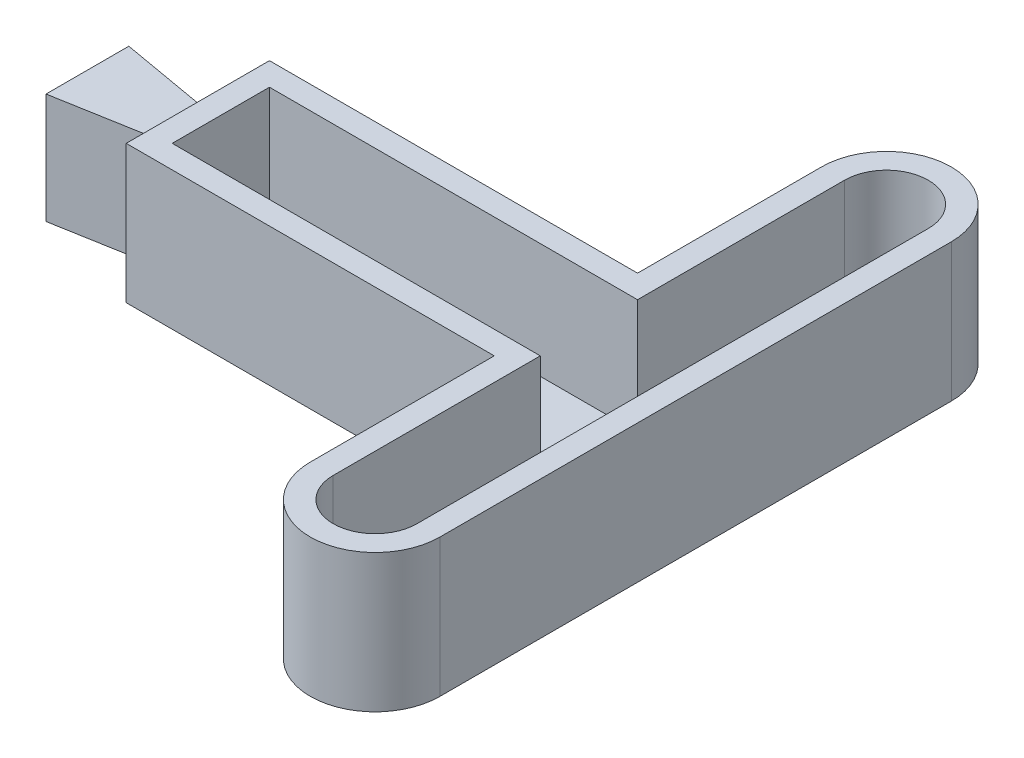
ISO-10303-21;
HEADER;
FILE_DESCRIPTION(('STEP AP214'),'2;1');
FILE_NAME('part.step','',(''),(''),'','','');
FILE_SCHEMA(('AUTOMOTIVE_DESIGN { 1 0 10303 214 1 1 1 1 }'));
ENDSEC;
DATA;
#1=APPLICATION_CONTEXT('core data for automotive mechanical design processes');
#2=APPLICATION_PROTOCOL_DEFINITION('international standard','automotive_design',2000,#1);
#3=PRODUCT_CONTEXT('',#1,'mechanical');
#4=PRODUCT('Part','Part','',(#3));
#5=PRODUCT_RELATED_PRODUCT_CATEGORY('part','',(#4));
#6=PRODUCT_DEFINITION_FORMATION('','',#4);
#7=PRODUCT_DEFINITION_CONTEXT('part definition',#1,'design');
#8=PRODUCT_DEFINITION('design','',#6,#7);
#9=PRODUCT_DEFINITION_SHAPE('','',#8);
#10=(LENGTH_UNIT() NAMED_UNIT(*) SI_UNIT(.MILLI.,.METRE.));
#11=(NAMED_UNIT(*) PLANE_ANGLE_UNIT() SI_UNIT($,.RADIAN.));
#12=(NAMED_UNIT(*) SI_UNIT($,.STERADIAN.) SOLID_ANGLE_UNIT());
#13=UNCERTAINTY_MEASURE_WITH_UNIT(LENGTH_MEASURE(1.E-05),#10,'distance_accuracy_value','');
#14=(GEOMETRIC_REPRESENTATION_CONTEXT(3) GLOBAL_UNCERTAINTY_ASSIGNED_CONTEXT((#13)) GLOBAL_UNIT_ASSIGNED_CONTEXT((#10,
#11,#12)) REPRESENTATION_CONTEXT('',''));
#15=CARTESIAN_POINT('',(0.,0.,0.));
#16=DIRECTION('',(0.,0.,1.));
#17=DIRECTION('',(1.,0.,0.));
#18=AXIS2_PLACEMENT_3D('',#15,#16,#17);
#19=CARTESIAN_POINT('',(0.,38.1,-11.43));
#20=DIRECTION('',(-0.173648177666928,0.,0.984807753012208));
#21=DIRECTION('',(0.984807753012209,0.,0.173648177666928));
#22=AXIS2_PLACEMENT_3D('',#19,#20,#21);
#23=PLANE('',#22);
#24=DIRECTION('',(0.,-1.,0.));
#25=VECTOR('',#24,1.);
#26=CARTESIAN_POINT('',(0.,38.1,-11.43));
#27=LINE('',#26,#25);
#28=CARTESIAN_POINT('',(0.,30.48,-11.43));
#29=VERTEX_POINT('',#28);
#30=CARTESIAN_POINT('',(0.,0.,-11.43));
#31=VERTEX_POINT('',#30);
#32=EDGE_CURVE('E11',#29,#31,#27,.T.);
#33=ORIENTED_EDGE('',*,*,#32,.F.);
#34=DIRECTION('',(0.984807753012209,0.,0.173648177666928));
#35=VECTOR('',#34,1.);
#36=CARTESIAN_POINT('',(0.,30.48,-11.43));
#37=LINE('',#36,#35);
#38=CARTESIAN_POINT('',(30.48,30.48,-6.05555362800607));
#39=VERTEX_POINT('',#38);
#40=EDGE_CURVE('E166',#29,#39,#37,.T.);
#41=ORIENTED_EDGE('',*,*,#40,.T.);
#42=DIRECTION('',(0.,-1.,0.));
#43=VECTOR('',#42,1.);
#44=CARTESIAN_POINT('',(30.48,38.1,-6.05555362800607));
#45=LINE('',#44,#43);
#46=CARTESIAN_POINT('',(30.48,0.,-6.05555362800607));
#47=VERTEX_POINT('',#46);
#48=EDGE_CURVE('E113',#39,#47,#45,.T.);
#49=ORIENTED_EDGE('',*,*,#48,.T.);
#50=DIRECTION('',(-0.984807753012208,0.,-0.173648177666928));
#51=VECTOR('',#50,1.);
#52=CARTESIAN_POINT('',(0.,0.,-11.43));
#53=LINE('',#52,#51);
#54=EDGE_CURVE('E163',#47,#31,#53,.T.);
#55=ORIENTED_EDGE('',*,*,#54,.T.);
#56=EDGE_LOOP('',(#33,#41,#49,#55));
#57=FACE_BOUND('',#56,.T.);
#58=ADVANCED_FACE('F44',(#57),#23,.F.);
#59=CARTESIAN_POINT('',(0.,38.1,-11.43));
#60=DIRECTION('',(1.,0.,0.));
#61=DIRECTION('',(0.,0.,-1.));
#62=AXIS2_PLACEMENT_3D('',#59,#60,#61);
#63=PLANE('',#62);
#64=DIRECTION('',(0.,-1.,0.));
#65=VECTOR('',#64,1.);
#66=CARTESIAN_POINT('',(0.,38.1,11.43));
#67=LINE('',#66,#65);
#68=CARTESIAN_POINT('',(0.,30.48,11.43));
#69=VERTEX_POINT('',#68);
#70=CARTESIAN_POINT('',(0.,0.,11.43));
#71=VERTEX_POINT('',#70);
#72=EDGE_CURVE('E51',#69,#71,#67,.T.);
#73=ORIENTED_EDGE('',*,*,#72,.F.);
#74=DIRECTION('',(0.,0.,1.));
#75=VECTOR('',#74,1.);
#76=CARTESIAN_POINT('',(0.,30.48,11.43));
#77=LINE('',#76,#75);
#78=EDGE_CURVE('E419',#29,#69,#77,.T.);
#79=ORIENTED_EDGE('',*,*,#78,.F.);
#80=ORIENTED_EDGE('',*,*,#32,.T.);
#81=DIRECTION('',(0.,0.,1.));
#82=VECTOR('',#81,1.);
#83=CARTESIAN_POINT('',(0.,0.,-11.43));
#84=LINE('',#83,#82);
#85=EDGE_CURVE('E165',#31,#71,#84,.T.);
#86=ORIENTED_EDGE('',*,*,#85,.T.);
#87=EDGE_LOOP('',(#73,#79,#80,#86));
#88=FACE_BOUND('',#87,.T.);
#89=ADVANCED_FACE('F219',(#88),#63,.F.);
#90=CARTESIAN_POINT('',(0.,38.1,11.43));
#91=DIRECTION('',(-0.173648177666928,0.,-0.984807753012208));
#92=DIRECTION('',(-0.984807753012209,0.,0.173648177666928));
#93=AXIS2_PLACEMENT_3D('',#90,#91,#92);
#94=PLANE('',#93);
#95=DIRECTION('',(0.,-1.,0.));
#96=VECTOR('',#95,1.);
#97=CARTESIAN_POINT('',(30.48,38.1,6.05555362800607));
#98=LINE('',#97,#96);
#99=CARTESIAN_POINT('',(30.48,30.48,6.05555362800607));
#100=VERTEX_POINT('',#99);
#101=CARTESIAN_POINT('',(30.48,0.,6.05555362800607));
#102=VERTEX_POINT('',#101);
#103=EDGE_CURVE('E206',#100,#102,#98,.T.);
#104=ORIENTED_EDGE('',*,*,#103,.F.);
#105=DIRECTION('',(0.984807753012209,0.,-0.173648177666928));
#106=VECTOR('',#105,1.);
#107=CARTESIAN_POINT('',(30.48,30.48,6.05555362800607));
#108=LINE('',#107,#106);
#109=EDGE_CURVE('E215',#69,#100,#108,.T.);
#110=ORIENTED_EDGE('',*,*,#109,.F.);
#111=ORIENTED_EDGE('',*,*,#72,.T.);
#112=DIRECTION('',(0.984807753012209,0.,-0.173648177666928));
#113=VECTOR('',#112,1.);
#114=CARTESIAN_POINT('',(0.,0.,11.43));
#115=LINE('',#114,#113);
#116=EDGE_CURVE('E169',#71,#102,#115,.T.);
#117=ORIENTED_EDGE('',*,*,#116,.T.);
#118=EDGE_LOOP('',(#104,#110,#111,#117));
#119=FACE_BOUND('',#118,.T.);
#120=ADVANCED_FACE('F211',(#119),#94,.F.);
#121=CARTESIAN_POINT('',(30.48,38.1,19.7715536280061));
#122=DIRECTION('',(0.,0.,-1.));
#123=DIRECTION('',(-1.,0.,0.));
#124=AXIS2_PLACEMENT_3D('',#121,#122,#123);
#125=PLANE('',#124);
#126=DIRECTION('',(1.,0.,0.));
#127=VECTOR('',#126,1.);
#128=CARTESIAN_POINT('',(30.48,0.,19.7715536280061));
#129=LINE('',#128,#127);
#130=CARTESIAN_POINT('',(30.48,0.,19.7715536280061));
#131=VERTEX_POINT('',#130);
#132=CARTESIAN_POINT('',(132.08,0.,19.7715536280061));
#133=VERTEX_POINT('',#132);
#134=EDGE_CURVE('E174',#131,#133,#129,.T.);
#135=ORIENTED_EDGE('',*,*,#134,.T.);
#136=DIRECTION('',(0.,-1.,0.));
#137=VECTOR('',#136,1.);
#138=CARTESIAN_POINT('',(132.08,38.1,19.7715536280061));
#139=LINE('',#138,#137);
#140=CARTESIAN_POINT('',(132.08,38.1,19.7715536280061));
#141=VERTEX_POINT('',#140);
#142=EDGE_CURVE('E200',#141,#133,#139,.T.);
#143=ORIENTED_EDGE('',*,*,#142,.F.);
#144=DIRECTION('',(1.,0.,0.));
#145=VECTOR('',#144,1.);
#146=CARTESIAN_POINT('',(30.48,38.1,19.7715536280061));
#147=LINE('',#146,#145);
#148=CARTESIAN_POINT('',(30.48,38.1,19.7715536280061));
#149=VERTEX_POINT('',#148);
#150=EDGE_CURVE('E232',#149,#141,#147,.T.);
#151=ORIENTED_EDGE('',*,*,#150,.F.);
#152=DIRECTION('',(0.,-1.,0.));
#153=VECTOR('',#152,1.);
#154=CARTESIAN_POINT('',(30.48,38.1,19.7715536280061));
#155=LINE('',#154,#153);
#156=EDGE_CURVE('E203',#149,#131,#155,.T.);
#157=ORIENTED_EDGE('',*,*,#156,.T.);
#158=EDGE_LOOP('',(#135,#143,#151,#157));
#159=FACE_BOUND('',#158,.T.);
#160=ADVANCED_FACE('F230',(#159),#125,.F.);
#161=CARTESIAN_POINT('',(132.08,38.1,19.7715536280061));
#162=DIRECTION('',(1.,0.,0.));
#163=DIRECTION('',(0.,0.,-1.));
#164=AXIS2_PLACEMENT_3D('',#161,#162,#163);
#165=PLANE('',#164);
#166=DIRECTION('',(0.,0.,1.));
#167=VECTOR('',#166,1.);
#168=CARTESIAN_POINT('',(132.08,0.,19.7715536280061));
#169=LINE('',#168,#167);
#170=CARTESIAN_POINT('',(132.08,0.,70.5715536280061));
#171=VERTEX_POINT('',#170);
#172=EDGE_CURVE('E176',#133,#171,#169,.T.);
#173=ORIENTED_EDGE('',*,*,#172,.T.);
#174=DIRECTION('',(0.,-1.,0.));
#175=VECTOR('',#174,1.);
#176=CARTESIAN_POINT('',(132.08,38.1,70.5715536280061));
#177=LINE('',#176,#175);
#178=CARTESIAN_POINT('',(132.08,38.1,70.5715536280061));
#179=VERTEX_POINT('',#178);
#180=EDGE_CURVE('E197',#179,#171,#177,.T.);
#181=ORIENTED_EDGE('',*,*,#180,.F.);
#182=DIRECTION('',(0.,0.,1.));
#183=VECTOR('',#182,1.);
#184=CARTESIAN_POINT('',(132.08,38.1,19.7715536280061));
#185=LINE('',#184,#183);
#186=EDGE_CURVE('E234',#141,#179,#185,.T.);
#187=ORIENTED_EDGE('',*,*,#186,.F.);
#188=ORIENTED_EDGE('',*,*,#142,.T.);
#189=EDGE_LOOP('',(#173,#181,#187,#188));
#190=FACE_BOUND('',#189,.T.);
#191=ADVANCED_FACE('F447',(#190),#165,.F.);
#192=CARTESIAN_POINT('',(149.987,38.1,70.5715536280061));
#193=DIRECTION('',(0.,-1.,0.));
#194=DIRECTION('',(0.,0.,-1.));
#195=AXIS2_PLACEMENT_3D('',#192,#193,#194);
#196=CYLINDRICAL_SURFACE('',#195,17.907);
#197=CARTESIAN_POINT('',(149.987,0.,70.5715536280061));
#198=DIRECTION('',(0.,1.,0.));
#199=DIRECTION('',(0.,0.,-1.));
#200=AXIS2_PLACEMENT_3D('',#197,#198,#199);
#201=CIRCLE('',#200,17.907);
#202=CARTESIAN_POINT('',(167.894,0.,70.5715536280061));
#203=VERTEX_POINT('',#202);
#204=EDGE_CURVE('E178',#171,#203,#201,.T.);
#205=ORIENTED_EDGE('',*,*,#204,.T.);
#206=DIRECTION('',(0.,-1.,0.));
#207=VECTOR('',#206,1.);
#208=CARTESIAN_POINT('',(167.894,38.1,70.5715536280061));
#209=LINE('',#208,#207);
#210=CARTESIAN_POINT('',(167.894,38.1,70.5715536280061));
#211=VERTEX_POINT('',#210);
#212=EDGE_CURVE('E194',#211,#203,#209,.T.);
#213=ORIENTED_EDGE('',*,*,#212,.F.);
#214=CARTESIAN_POINT('',(149.987,38.1,70.5715536280061));
#215=DIRECTION('',(0.,1.,0.));
#216=DIRECTION('',(0.,0.,-1.));
#217=AXIS2_PLACEMENT_3D('',#214,#215,#216);
#218=CIRCLE('',#217,17.907);
#219=EDGE_CURVE('E236',#179,#211,#218,.T.);
#220=ORIENTED_EDGE('',*,*,#219,.F.);
#221=ORIENTED_EDGE('',*,*,#180,.T.);
#222=EDGE_LOOP('',(#205,#213,#220,#221));
#223=FACE_BOUND('',#222,.T.);
#224=ADVANCED_FACE('F245',(#223),#196,.T.);
#225=CARTESIAN_POINT('',(167.894,38.1,-70.5715536280061));
#226=DIRECTION('',(-1.,0.,0.));
#227=DIRECTION('',(0.,0.,1.));
#228=AXIS2_PLACEMENT_3D('',#225,#226,#227);
#229=PLANE('',#228);
#230=DIRECTION('',(0.,0.,-1.));
#231=VECTOR('',#230,1.);
#232=CARTESIAN_POINT('',(167.894,0.,-70.5715536280061));
#233=LINE('',#232,#231);
#234=CARTESIAN_POINT('',(167.894,0.,-70.5715536280061));
#235=VERTEX_POINT('',#234);
#236=EDGE_CURVE('E180',#203,#235,#233,.T.);
#237=ORIENTED_EDGE('',*,*,#236,.T.);
#238=DIRECTION('',(0.,-1.,0.));
#239=VECTOR('',#238,1.);
#240=CARTESIAN_POINT('',(167.894,38.1,-70.5715536280061));
#241=LINE('',#240,#239);
#242=CARTESIAN_POINT('',(167.894,38.1,-70.5715536280061));
#243=VERTEX_POINT('',#242);
#244=EDGE_CURVE('E152',#243,#235,#241,.T.);
#245=ORIENTED_EDGE('',*,*,#244,.F.);
#246=DIRECTION('',(0.,0.,-1.));
#247=VECTOR('',#246,1.);
#248=CARTESIAN_POINT('',(167.894,38.1,-70.5715536280061));
#249=LINE('',#248,#247);
#250=EDGE_CURVE('E140',#211,#243,#249,.T.);
#251=ORIENTED_EDGE('',*,*,#250,.F.);
#252=ORIENTED_EDGE('',*,*,#212,.T.);
#253=EDGE_LOOP('',(#237,#245,#251,#252));
#254=FACE_BOUND('',#253,.T.);
#255=ADVANCED_FACE('F249',(#254),#229,.F.);
#256=CARTESIAN_POINT('',(149.987,38.1,-70.5715536280061));
#257=DIRECTION('',(0.,-1.,0.));
#258=DIRECTION('',(0.,0.,-1.));
#259=AXIS2_PLACEMENT_3D('',#256,#257,#258);
#260=CYLINDRICAL_SURFACE('',#259,17.907);
#261=CARTESIAN_POINT('',(149.987,0.,-70.5715536280061));
#262=DIRECTION('',(0.,1.,0.));
#263=DIRECTION('',(0.,0.,1.));
#264=AXIS2_PLACEMENT_3D('',#261,#262,#263);
#265=CIRCLE('',#264,17.907);
#266=CARTESIAN_POINT('',(132.08,0.,-70.5715536280061));
#267=VERTEX_POINT('',#266);
#268=EDGE_CURVE('E149',#235,#267,#265,.T.);
#269=ORIENTED_EDGE('',*,*,#268,.T.);
#270=DIRECTION('',(0.,-1.,0.));
#271=VECTOR('',#270,1.);
#272=CARTESIAN_POINT('',(132.08,38.1,-70.5715536280061));
#273=LINE('',#272,#271);
#274=CARTESIAN_POINT('',(132.08,38.1,-70.5715536280061));
#275=VERTEX_POINT('',#274);
#276=EDGE_CURVE('E146',#275,#267,#273,.T.);
#277=ORIENTED_EDGE('',*,*,#276,.F.);
#278=CARTESIAN_POINT('',(149.987,38.1,-70.5715536280061));
#279=DIRECTION('',(0.,1.,0.));
#280=DIRECTION('',(0.,0.,1.));
#281=AXIS2_PLACEMENT_3D('',#278,#279,#280);
#282=CIRCLE('',#281,17.907);
#283=EDGE_CURVE('E133',#243,#275,#282,.T.);
#284=ORIENTED_EDGE('',*,*,#283,.F.);
#285=ORIENTED_EDGE('',*,*,#244,.T.);
#286=EDGE_LOOP('',(#269,#277,#284,#285));
#287=FACE_BOUND('',#286,.T.);
#288=ADVANCED_FACE('F147',(#287),#260,.T.);
#289=CARTESIAN_POINT('',(132.08,38.1,-19.7715536280061));
#290=DIRECTION('',(1.,0.,0.));
#291=DIRECTION('',(0.,0.,-1.));
#292=AXIS2_PLACEMENT_3D('',#289,#290,#291);
#293=PLANE('',#292);
#294=DIRECTION('',(0.,0.,1.));
#295=VECTOR('',#294,1.);
#296=CARTESIAN_POINT('',(132.08,0.,-19.7715536280061));
#297=LINE('',#296,#295);
#298=CARTESIAN_POINT('',(132.08,0.,-19.7715536280061));
#299=VERTEX_POINT('',#298);
#300=EDGE_CURVE('E183',#267,#299,#297,.T.);
#301=ORIENTED_EDGE('',*,*,#300,.T.);
#302=DIRECTION('',(0.,-1.,0.));
#303=VECTOR('',#302,1.);
#304=CARTESIAN_POINT('',(132.08,38.1,-19.7715536280061));
#305=LINE('',#304,#303);
#306=CARTESIAN_POINT('',(132.08,38.1,-19.7715536280061));
#307=VERTEX_POINT('',#306);
#308=EDGE_CURVE('E153',#307,#299,#305,.T.);
#309=ORIENTED_EDGE('',*,*,#308,.F.);
#310=DIRECTION('',(0.,0.,1.));
#311=VECTOR('',#310,1.);
#312=CARTESIAN_POINT('',(132.08,38.1,-19.7715536280061));
#313=LINE('',#312,#311);
#314=EDGE_CURVE('E137',#275,#307,#313,.T.);
#315=ORIENTED_EDGE('',*,*,#314,.F.);
#316=ORIENTED_EDGE('',*,*,#276,.T.);
#317=EDGE_LOOP('',(#301,#309,#315,#316));
#318=FACE_BOUND('',#317,.T.);
#319=ADVANCED_FACE('F155',(#318),#293,.F.);
#320=CARTESIAN_POINT('',(30.48,38.1,-19.7715536280061));
#321=DIRECTION('',(0.,0.,1.));
#322=DIRECTION('',(1.,0.,0.));
#323=AXIS2_PLACEMENT_3D('',#320,#321,#322);
#324=PLANE('',#323);
#325=DIRECTION('',(-1.,0.,0.));
#326=VECTOR('',#325,1.);
#327=CARTESIAN_POINT('',(30.48,0.,-19.7715536280061));
#328=LINE('',#327,#326);
#329=CARTESIAN_POINT('',(30.48,0.,-19.7715536280061));
#330=VERTEX_POINT('',#329);
#331=EDGE_CURVE('E185',#299,#330,#328,.T.);
#332=ORIENTED_EDGE('',*,*,#331,.T.);
#333=DIRECTION('',(0.,-1.,0.));
#334=VECTOR('',#333,1.);
#335=CARTESIAN_POINT('',(30.48,38.1,-19.7715536280061));
#336=LINE('',#335,#334);
#337=CARTESIAN_POINT('',(30.48,38.1,-19.7715536280061));
#338=VERTEX_POINT('',#337);
#339=EDGE_CURVE('E190',#338,#330,#336,.T.);
#340=ORIENTED_EDGE('',*,*,#339,.F.);
#341=DIRECTION('',(-1.,0.,0.));
#342=VECTOR('',#341,1.);
#343=CARTESIAN_POINT('',(30.48,38.1,-19.7715536280061));
#344=LINE('',#343,#342);
#345=EDGE_CURVE('E158',#307,#338,#344,.T.);
#346=ORIENTED_EDGE('',*,*,#345,.F.);
#347=ORIENTED_EDGE('',*,*,#308,.T.);
#348=EDGE_LOOP('',(#332,#340,#346,#347));
#349=FACE_BOUND('',#348,.T.);
#350=ADVANCED_FACE('F253',(#349),#324,.F.);
#351=CARTESIAN_POINT('',(30.48,38.1,-6.05555362800607));
#352=DIRECTION('',(1.,0.,0.));
#353=DIRECTION('',(0.,0.,-1.));
#354=AXIS2_PLACEMENT_3D('',#351,#352,#353);
#355=PLANE('',#354);
#356=DIRECTION('',(0.,0.,1.));
#357=VECTOR('',#356,1.);
#358=CARTESIAN_POINT('',(30.48,0.,-6.05555362800607));
#359=LINE('',#358,#357);
#360=EDGE_CURVE('E187',#330,#47,#359,.T.);
#361=ORIENTED_EDGE('',*,*,#360,.T.);
#362=ORIENTED_EDGE('',*,*,#48,.F.);
#363=DIRECTION('',(0.,0.,-1.));
#364=VECTOR('',#363,1.);
#365=CARTESIAN_POINT('',(30.48,30.48,-6.05555362800607));
#366=LINE('',#365,#364);
#367=EDGE_CURVE('E417',#100,#39,#366,.T.);
#368=ORIENTED_EDGE('',*,*,#367,.F.);
#369=ORIENTED_EDGE('',*,*,#103,.T.);
#370=DIRECTION('',(0.,0.,1.));
#371=VECTOR('',#370,1.);
#372=CARTESIAN_POINT('',(30.48,0.,6.05555362800607));
#373=LINE('',#372,#371);
#374=EDGE_CURVE('E172',#102,#131,#373,.T.);
#375=ORIENTED_EDGE('',*,*,#374,.T.);
#376=ORIENTED_EDGE('',*,*,#156,.F.);
#377=DIRECTION('',(0.,0.,1.));
#378=VECTOR('',#377,1.);
#379=CARTESIAN_POINT('',(30.48,38.1,6.05555362800607));
#380=LINE('',#379,#378);
#381=EDGE_CURVE('E67',#338,#149,#380,.T.);
#382=ORIENTED_EDGE('',*,*,#381,.F.);
#383=ORIENTED_EDGE('',*,*,#339,.T.);
#384=EDGE_LOOP('',(#361,#362,#368,#369,#375,#376,#382,#383));
#385=FACE_BOUND('',#384,.T.);
#386=ADVANCED_FACE('F226',(#385),#355,.F.);
#387=CARTESIAN_POINT('',(149.987,38.1,-70.5715536280061));
#388=DIRECTION('',(0.,1.,0.));
#389=DIRECTION('',(0.,0.,1.));
#390=AXIS2_PLACEMENT_3D('',#387,#388,#389);
#391=PLANE('',#390);
#392=DIRECTION('',(-1.,0.,0.));
#393=VECTOR('',#392,1.);
#394=CARTESIAN_POINT('',(30.48,38.1,-13.4215536280061));
#395=LINE('',#394,#393);
#396=CARTESIAN_POINT('',(138.43,38.1,-13.4215536280061));
#397=VERTEX_POINT('',#396);
#398=CARTESIAN_POINT('',(36.83,38.1,-13.4215536280061));
#399=VERTEX_POINT('',#398);
#400=EDGE_CURVE('E374',#397,#399,#395,.T.);
#401=ORIENTED_EDGE('',*,*,#400,.F.);
#402=DIRECTION('',(0.,0.,1.));
#403=VECTOR('',#402,1.);
#404=CARTESIAN_POINT('',(138.43,38.1,-19.7715536280061));
#405=LINE('',#404,#403);
#406=CARTESIAN_POINT('',(138.43,38.1,-70.5715536280061));
#407=VERTEX_POINT('',#406);
#408=EDGE_CURVE('E412',#407,#397,#405,.T.);
#409=ORIENTED_EDGE('',*,*,#408,.F.);
#410=CARTESIAN_POINT('',(149.987,38.1,-70.5715536280061));
#411=DIRECTION('',(0.,1.,0.));
#412=DIRECTION('',(0.,0.,1.));
#413=AXIS2_PLACEMENT_3D('',#410,#411,#412);
#414=CIRCLE('',#413,11.557);
#415=CARTESIAN_POINT('',(161.544,38.1,-70.5715536280061));
#416=VERTEX_POINT('',#415);
#417=EDGE_CURVE('E410',#416,#407,#414,.T.);
#418=ORIENTED_EDGE('',*,*,#417,.F.);
#419=DIRECTION('',(0.,0.,-1.));
#420=VECTOR('',#419,1.);
#421=CARTESIAN_POINT('',(161.544,38.1,-70.5715536280061));
#422=LINE('',#421,#420);
#423=CARTESIAN_POINT('',(161.544,38.1,70.5715536280061));
#424=VERTEX_POINT('',#423);
#425=EDGE_CURVE('E408',#424,#416,#422,.T.);
#426=ORIENTED_EDGE('',*,*,#425,.F.);
#427=CARTESIAN_POINT('',(149.987,38.1,70.5715536280061));
#428=DIRECTION('',(0.,1.,0.));
#429=DIRECTION('',(0.,0.,1.));
#430=AXIS2_PLACEMENT_3D('',#427,#428,#429);
#431=CIRCLE('',#430,11.557);
#432=CARTESIAN_POINT('',(138.43,38.1,70.5715536280061));
#433=VERTEX_POINT('',#432);
#434=EDGE_CURVE('E406',#433,#424,#431,.T.);
#435=ORIENTED_EDGE('',*,*,#434,.F.);
#436=DIRECTION('',(0.,0.,1.));
#437=VECTOR('',#436,1.);
#438=CARTESIAN_POINT('',(138.43,38.1,19.7715536280061));
#439=LINE('',#438,#437);
#440=CARTESIAN_POINT('',(138.43,38.1,13.4215536280061));
#441=VERTEX_POINT('',#440);
#442=EDGE_CURVE('E404',#441,#433,#439,.T.);
#443=ORIENTED_EDGE('',*,*,#442,.F.);
#444=DIRECTION('',(1.,0.,0.));
#445=VECTOR('',#444,1.);
#446=CARTESIAN_POINT('',(30.48,38.1,13.4215536280061));
#447=LINE('',#446,#445);
#448=CARTESIAN_POINT('',(36.83,38.1,13.4215536280061));
#449=VERTEX_POINT('',#448);
#450=EDGE_CURVE('E402',#449,#441,#447,.T.);
#451=ORIENTED_EDGE('',*,*,#450,.F.);
#452=DIRECTION('',(0.,0.,1.));
#453=VECTOR('',#452,1.);
#454=CARTESIAN_POINT('',(36.83,38.1,-6.05555362800606));
#455=LINE('',#454,#453);
#456=EDGE_CURVE('E365',#399,#449,#455,.T.);
#457=ORIENTED_EDGE('',*,*,#456,.F.);
#458=EDGE_LOOP('',(#401,#409,#418,#426,#435,#443,#451,#457));
#459=FACE_BOUND('',#458,.T.);
#460=ORIENTED_EDGE('',*,*,#345,.T.);
#461=ORIENTED_EDGE('',*,*,#381,.T.);
#462=ORIENTED_EDGE('',*,*,#150,.T.);
#463=ORIENTED_EDGE('',*,*,#186,.T.);
#464=ORIENTED_EDGE('',*,*,#219,.T.);
#465=ORIENTED_EDGE('',*,*,#250,.T.);
#466=ORIENTED_EDGE('',*,*,#283,.T.);
#467=ORIENTED_EDGE('',*,*,#314,.T.);
#468=EDGE_LOOP('',(#460,#461,#462,#463,#464,#465,#466,#467));
#469=FACE_BOUND('',#468,.T.);
#470=ADVANCED_FACE('F135',(#459,#469),#391,.T.);
#471=CARTESIAN_POINT('',(149.987,0.,-70.5715536280061));
#472=DIRECTION('',(0.,1.,0.));
#473=DIRECTION('',(0.,0.,1.));
#474=AXIS2_PLACEMENT_3D('',#471,#472,#473);
#475=PLANE('',#474);
#476=ORIENTED_EDGE('',*,*,#54,.F.);
#477=ORIENTED_EDGE('',*,*,#360,.F.);
#478=ORIENTED_EDGE('',*,*,#331,.F.);
#479=ORIENTED_EDGE('',*,*,#300,.F.);
#480=ORIENTED_EDGE('',*,*,#268,.F.);
#481=ORIENTED_EDGE('',*,*,#236,.F.);
#482=ORIENTED_EDGE('',*,*,#204,.F.);
#483=ORIENTED_EDGE('',*,*,#172,.F.);
#484=ORIENTED_EDGE('',*,*,#134,.F.);
#485=ORIENTED_EDGE('',*,*,#374,.F.);
#486=ORIENTED_EDGE('',*,*,#116,.F.);
#487=ORIENTED_EDGE('',*,*,#85,.F.);
#488=EDGE_LOOP('',(#476,#477,#478,#479,#480,#481,#482,#483,#484,#485,#486,#487));
#489=FACE_BOUND('',#488,.T.);
#490=ADVANCED_FACE('F223',(#489),#475,.F.);
#491=CARTESIAN_POINT('',(0.,30.48,0.));
#492=DIRECTION('',(0.,-1.,0.));
#493=DIRECTION('',(0.,0.,-1.));
#494=AXIS2_PLACEMENT_3D('',#491,#492,#493);
#495=PLANE('',#494);
#496=ORIENTED_EDGE('',*,*,#78,.T.);
#497=ORIENTED_EDGE('',*,*,#109,.T.);
#498=ORIENTED_EDGE('',*,*,#367,.T.);
#499=ORIENTED_EDGE('',*,*,#40,.F.);
#500=EDGE_LOOP('',(#496,#497,#498,#499));
#501=FACE_BOUND('',#500,.T.);
#502=ADVANCED_FACE('F420',(#501),#495,.F.);
#503=CARTESIAN_POINT('',(36.83,38.1,-6.05555362800606));
#504=DIRECTION('',(1.,0.,0.));
#505=DIRECTION('',(0.,0.,-1.));
#506=AXIS2_PLACEMENT_3D('',#503,#504,#505);
#507=PLANE('',#506);
#508=DIRECTION('',(0.,0.,1.));
#509=VECTOR('',#508,1.);
#510=CARTESIAN_POINT('',(36.83,6.35,-6.05555362800606));
#511=LINE('',#510,#509);
#512=CARTESIAN_POINT('',(36.83,6.35,-13.4215536280061));
#513=VERTEX_POINT('',#512);
#514=CARTESIAN_POINT('',(36.83,6.35,13.4215536280061));
#515=VERTEX_POINT('',#514);
#516=EDGE_CURVE('E363',#513,#515,#511,.T.);
#517=ORIENTED_EDGE('',*,*,#516,.F.);
#518=DIRECTION('',(0.,-1.,0.));
#519=VECTOR('',#518,1.);
#520=CARTESIAN_POINT('',(36.83,38.1,-13.4215536280061));
#521=LINE('',#520,#519);
#522=EDGE_CURVE('E370',#399,#513,#521,.T.);
#523=ORIENTED_EDGE('',*,*,#522,.F.);
#524=ORIENTED_EDGE('',*,*,#456,.T.);
#525=DIRECTION('',(0.,-1.,0.));
#526=VECTOR('',#525,1.);
#527=CARTESIAN_POINT('',(36.83,38.1,13.4215536280061));
#528=LINE('',#527,#526);
#529=EDGE_CURVE('E356',#449,#515,#528,.T.);
#530=ORIENTED_EDGE('',*,*,#529,.T.);
#531=EDGE_LOOP('',(#517,#523,#524,#530));
#532=FACE_BOUND('',#531,.T.);
#533=ADVANCED_FACE('F422',(#532),#507,.T.);
#534=CARTESIAN_POINT('',(30.48,38.1,-13.4215536280061));
#535=DIRECTION('',(0.,0.,1.));
#536=DIRECTION('',(1.,0.,0.));
#537=AXIS2_PLACEMENT_3D('',#534,#535,#536);
#538=PLANE('',#537);
#539=DIRECTION('',(-1.,0.,0.));
#540=VECTOR('',#539,1.);
#541=CARTESIAN_POINT('',(30.48,6.35,-13.4215536280061));
#542=LINE('',#541,#540);
#543=CARTESIAN_POINT('',(138.43,6.35,-13.4215536280061));
#544=VERTEX_POINT('',#543);
#545=EDGE_CURVE('E366',#544,#513,#542,.T.);
#546=ORIENTED_EDGE('',*,*,#545,.F.);
#547=DIRECTION('',(0.,-1.,0.));
#548=VECTOR('',#547,1.);
#549=CARTESIAN_POINT('',(138.43,38.1,-13.4215536280061));
#550=LINE('',#549,#548);
#551=EDGE_CURVE('E373',#397,#544,#550,.T.);
#552=ORIENTED_EDGE('',*,*,#551,.F.);
#553=ORIENTED_EDGE('',*,*,#400,.T.);
#554=ORIENTED_EDGE('',*,*,#522,.T.);
#555=EDGE_LOOP('',(#546,#552,#553,#554));
#556=FACE_BOUND('',#555,.T.);
#557=ADVANCED_FACE('F429',(#556),#538,.T.);
#558=CARTESIAN_POINT('',(138.43,38.1,-19.7715536280061));
#559=DIRECTION('',(1.,0.,0.));
#560=DIRECTION('',(0.,0.,-1.));
#561=AXIS2_PLACEMENT_3D('',#558,#559,#560);
#562=PLANE('',#561);
#563=DIRECTION('',(0.,0.,1.));
#564=VECTOR('',#563,1.);
#565=CARTESIAN_POINT('',(138.43,6.35,-19.7715536280061));
#566=LINE('',#565,#564);
#567=CARTESIAN_POINT('',(138.43,6.35,-70.5715536280061));
#568=VERTEX_POINT('',#567);
#569=EDGE_CURVE('E395',#568,#544,#566,.T.);
#570=ORIENTED_EDGE('',*,*,#569,.F.);
#571=DIRECTION('',(0.,1.,0.));
#572=VECTOR('',#571,1.);
#573=CARTESIAN_POINT('',(138.43,38.1,-70.5715536280061));
#574=LINE('',#573,#572);
#575=EDGE_CURVE('E58',#407,#568,#574,.F.);
#576=ORIENTED_EDGE('',*,*,#575,.F.);
#577=ORIENTED_EDGE('',*,*,#408,.T.);
#578=ORIENTED_EDGE('',*,*,#551,.T.);
#579=EDGE_LOOP('',(#570,#576,#577,#578));
#580=FACE_BOUND('',#579,.T.);
#581=ADVANCED_FACE('F479',(#580),#562,.T.);
#582=CARTESIAN_POINT('',(149.987,38.1,-70.5715536280061));
#583=DIRECTION('',(0.,-1.,0.));
#584=DIRECTION('',(0.,0.,-1.));
#585=AXIS2_PLACEMENT_3D('',#582,#583,#584);
#586=CYLINDRICAL_SURFACE('',#585,11.557);
#587=CARTESIAN_POINT('',(149.987,6.35,-70.5715536280061));
#588=DIRECTION('',(0.,1.,0.));
#589=DIRECTION('',(0.,0.,1.));
#590=AXIS2_PLACEMENT_3D('',#587,#588,#589);
#591=CIRCLE('',#590,11.557);
#592=CARTESIAN_POINT('',(161.544,6.35,-70.5715536280061));
#593=VERTEX_POINT('',#592);
#594=EDGE_CURVE('E391',#593,#568,#591,.T.);
#595=ORIENTED_EDGE('',*,*,#594,.F.);
#596=DIRECTION('',(0.,-1.,0.));
#597=VECTOR('',#596,1.);
#598=CARTESIAN_POINT('',(161.544,38.1,-70.5715536280061));
#599=LINE('',#598,#597);
#600=EDGE_CURVE('E389',#416,#593,#599,.T.);
#601=ORIENTED_EDGE('',*,*,#600,.F.);
#602=ORIENTED_EDGE('',*,*,#417,.T.);
#603=ORIENTED_EDGE('',*,*,#575,.T.);
#604=EDGE_LOOP('',(#595,#601,#602,#603));
#605=FACE_BOUND('',#604,.T.);
#606=ADVANCED_FACE('F481',(#605),#586,.F.);
#607=CARTESIAN_POINT('',(161.544,38.1,-70.5715536280061));
#608=DIRECTION('',(-1.,0.,0.));
#609=DIRECTION('',(0.,0.,1.));
#610=AXIS2_PLACEMENT_3D('',#607,#608,#609);
#611=PLANE('',#610);
#612=DIRECTION('',(0.,0.,-1.));
#613=VECTOR('',#612,1.);
#614=CARTESIAN_POINT('',(161.544,6.35,-70.5715536280061));
#615=LINE('',#614,#613);
#616=CARTESIAN_POINT('',(161.544,6.35,70.5715536280061));
#617=VERTEX_POINT('',#616);
#618=EDGE_CURVE('E386',#617,#593,#615,.T.);
#619=ORIENTED_EDGE('',*,*,#618,.F.);
#620=DIRECTION('',(0.,1.,0.));
#621=VECTOR('',#620,1.);
#622=CARTESIAN_POINT('',(161.544,38.1,70.5715536280061));
#623=LINE('',#622,#621);
#624=EDGE_CURVE('E384',#424,#617,#623,.F.);
#625=ORIENTED_EDGE('',*,*,#624,.F.);
#626=ORIENTED_EDGE('',*,*,#425,.T.);
#627=ORIENTED_EDGE('',*,*,#600,.T.);
#628=EDGE_LOOP('',(#619,#625,#626,#627));
#629=FACE_BOUND('',#628,.T.);
#630=ADVANCED_FACE('F487',(#629),#611,.T.);
#631=CARTESIAN_POINT('',(149.987,38.1,70.5715536280061));
#632=DIRECTION('',(0.,-1.,0.));
#633=DIRECTION('',(0.,0.,-1.));
#634=AXIS2_PLACEMENT_3D('',#631,#632,#633);
#635=CYLINDRICAL_SURFACE('',#634,11.557);
#636=CARTESIAN_POINT('',(149.987,6.35,70.5715536280061));
#637=DIRECTION('',(0.,1.,0.));
#638=DIRECTION('',(0.,0.,1.));
#639=AXIS2_PLACEMENT_3D('',#636,#637,#638);
#640=CIRCLE('',#639,11.557);
#641=CARTESIAN_POINT('',(138.43,6.35,70.5715536280061));
#642=VERTEX_POINT('',#641);
#643=EDGE_CURVE('E381',#642,#617,#640,.T.);
#644=ORIENTED_EDGE('',*,*,#643,.F.);
#645=DIRECTION('',(0.,-1.,0.));
#646=VECTOR('',#645,1.);
#647=CARTESIAN_POINT('',(138.43,38.1,70.5715536280061));
#648=LINE('',#647,#646);
#649=EDGE_CURVE('E379',#433,#642,#648,.T.);
#650=ORIENTED_EDGE('',*,*,#649,.F.);
#651=ORIENTED_EDGE('',*,*,#434,.T.);
#652=ORIENTED_EDGE('',*,*,#624,.T.);
#653=EDGE_LOOP('',(#644,#650,#651,#652));
#654=FACE_BOUND('',#653,.T.);
#655=ADVANCED_FACE('F520',(#654),#635,.F.);
#656=CARTESIAN_POINT('',(138.43,38.1,19.7715536280061));
#657=DIRECTION('',(1.,0.,0.));
#658=DIRECTION('',(0.,0.,-1.));
#659=AXIS2_PLACEMENT_3D('',#656,#657,#658);
#660=PLANE('',#659);
#661=DIRECTION('',(0.,0.,1.));
#662=VECTOR('',#661,1.);
#663=CARTESIAN_POINT('',(138.43,6.35,19.7715536280061));
#664=LINE('',#663,#662);
#665=CARTESIAN_POINT('',(138.43,6.35,13.4215536280061));
#666=VERTEX_POINT('',#665);
#667=EDGE_CURVE('E376',#666,#642,#664,.T.);
#668=ORIENTED_EDGE('',*,*,#667,.F.);
#669=DIRECTION('',(0.,-1.,0.));
#670=VECTOR('',#669,1.);
#671=CARTESIAN_POINT('',(138.43,38.1,13.4215536280061));
#672=LINE('',#671,#670);
#673=EDGE_CURVE('E369',#441,#666,#672,.T.);
#674=ORIENTED_EDGE('',*,*,#673,.F.);
#675=ORIENTED_EDGE('',*,*,#442,.T.);
#676=ORIENTED_EDGE('',*,*,#649,.T.);
#677=EDGE_LOOP('',(#668,#674,#675,#676));
#678=FACE_BOUND('',#677,.T.);
#679=ADVANCED_FACE('F516',(#678),#660,.T.);
#680=CARTESIAN_POINT('',(30.48,38.1,13.4215536280061));
#681=DIRECTION('',(0.,0.,-1.));
#682=DIRECTION('',(-1.,0.,0.));
#683=AXIS2_PLACEMENT_3D('',#680,#681,#682);
#684=PLANE('',#683);
#685=DIRECTION('',(1.,0.,0.));
#686=VECTOR('',#685,1.);
#687=CARTESIAN_POINT('',(30.48,6.35,13.4215536280061));
#688=LINE('',#687,#686);
#689=EDGE_CURVE('E362',#515,#666,#688,.T.);
#690=ORIENTED_EDGE('',*,*,#689,.F.);
#691=ORIENTED_EDGE('',*,*,#529,.F.);
#692=ORIENTED_EDGE('',*,*,#450,.T.);
#693=ORIENTED_EDGE('',*,*,#673,.T.);
#694=EDGE_LOOP('',(#690,#691,#692,#693));
#695=FACE_BOUND('',#694,.T.);
#696=ADVANCED_FACE('F513',(#695),#684,.T.);
#697=CARTESIAN_POINT('',(149.987,6.35,-70.5715536280061));
#698=DIRECTION('',(0.,1.,0.));
#699=DIRECTION('',(0.,0.,1.));
#700=AXIS2_PLACEMENT_3D('',#697,#698,#699);
#701=PLANE('',#700);
#702=ORIENTED_EDGE('',*,*,#689,.T.);
#703=ORIENTED_EDGE('',*,*,#667,.T.);
#704=ORIENTED_EDGE('',*,*,#643,.T.);
#705=ORIENTED_EDGE('',*,*,#618,.T.);
#706=ORIENTED_EDGE('',*,*,#594,.T.);
#707=ORIENTED_EDGE('',*,*,#569,.T.);
#708=ORIENTED_EDGE('',*,*,#545,.T.);
#709=ORIENTED_EDGE('',*,*,#516,.T.);
#710=EDGE_LOOP('',(#702,#703,#704,#705,#706,#707,#708,#709));
#711=FACE_BOUND('',#710,.T.);
#712=ADVANCED_FACE('F477',(#711),#701,.T.);
#713=CLOSED_SHELL('',(#58,#89,#120,#160,#191,#224,#255,#288,#319,#350,#386,#470,#490,#502,#533,
#557,#581,#606,#630,#655,#679,#696,#712));
#714=CARTESIAN_POINT('',(-1.102665928185,38.1,-5.17647076837248));
#715=DIRECTION('',(-0.173648177666928,0.,0.984807753012208));
#716=DIRECTION('',(0.984807753012209,0.,0.173648177666928));
#717=AXIS2_PLACEMENT_3D('',#714,#715,#716);
#718=PLANE('',#717);
#719=DIRECTION('',(0.984807753012209,0.,0.173648177666928));
#720=VECTOR('',#719,1.);
#721=CARTESIAN_POINT('',(-1.102665928185,24.13,-5.17647076837248));
#722=LINE('',#721,#720);
#723=CARTESIAN_POINT('',(6.35,24.13,-3.86236468702679));
#724=VERTEX_POINT('',#723);
#725=CARTESIAN_POINT('',(28.2545586302688,24.13,0.));
#726=VERTEX_POINT('',#725);
#727=EDGE_CURVE('E335',#724,#726,#722,.T.);
#728=ORIENTED_EDGE('',*,*,#727,.F.);
#729=DIRECTION('',(0.,-1.,0.));
#730=VECTOR('',#729,1.);
#731=CARTESIAN_POINT('',(6.35,38.1,-3.86236468702679));
#732=LINE('',#731,#730);
#733=CARTESIAN_POINT('',(6.35,6.35,-3.86236468702679));
#734=VERTEX_POINT('',#733);
#735=EDGE_CURVE('E329',#724,#734,#732,.T.);
#736=ORIENTED_EDGE('',*,*,#735,.T.);
#737=DIRECTION('',(-0.984807753012209,0.,-0.173648177666928));
#738=VECTOR('',#737,1.);
#739=CARTESIAN_POINT('',(-1.102665928185,6.35,-5.17647076837248));
#740=LINE('',#739,#738);
#741=CARTESIAN_POINT('',(28.2545586302688,6.35,0.));
#742=VERTEX_POINT('',#741);
#743=EDGE_CURVE('E333',#742,#734,#740,.T.);
#744=ORIENTED_EDGE('',*,*,#743,.F.);
#745=DIRECTION('',(0.,-1.,0.));
#746=VECTOR('',#745,1.);
#747=CARTESIAN_POINT('',(28.2545586302688,38.1,0.));
#748=LINE('',#747,#746);
#749=EDGE_CURVE('E338',#726,#742,#748,.T.);
#750=ORIENTED_EDGE('',*,*,#749,.F.);
#751=EDGE_LOOP('',(#728,#736,#744,#750));
#752=FACE_BOUND('',#751,.T.);
#753=ADVANCED_FACE('F331',(#752),#718,.T.);
#754=CARTESIAN_POINT('',(6.34999999999999,38.1,-11.43));
#755=DIRECTION('',(1.,0.,0.));
#756=DIRECTION('',(0.,0.,-1.));
#757=AXIS2_PLACEMENT_3D('',#754,#755,#756);
#758=PLANE('',#757);
#759=DIRECTION('',(0.,-1.,0.));
#760=VECTOR('',#759,1.);
#761=CARTESIAN_POINT('',(6.35,38.1,3.86236468702679));
#762=LINE('',#761,#760);
#763=CARTESIAN_POINT('',(6.35,24.13,3.86236468702679));
#764=VERTEX_POINT('',#763);
#765=CARTESIAN_POINT('',(6.35,6.35,3.86236468702679));
#766=VERTEX_POINT('',#765);
#767=EDGE_CURVE('E339',#764,#766,#762,.T.);
#768=ORIENTED_EDGE('',*,*,#767,.T.);
#769=DIRECTION('',(0.,0.,1.));
#770=VECTOR('',#769,1.);
#771=CARTESIAN_POINT('',(6.34999999999999,6.35,-11.43));
#772=LINE('',#771,#770);
#773=EDGE_CURVE('E343',#734,#766,#772,.T.);
#774=ORIENTED_EDGE('',*,*,#773,.F.);
#775=ORIENTED_EDGE('',*,*,#735,.F.);
#776=DIRECTION('',(0.,0.,1.));
#777=VECTOR('',#776,1.);
#778=CARTESIAN_POINT('',(6.35,24.13,0.));
#779=LINE('',#778,#777);
#780=EDGE_CURVE('E352',#724,#764,#779,.T.);
#781=ORIENTED_EDGE('',*,*,#780,.T.);
#782=EDGE_LOOP('',(#768,#774,#775,#781));
#783=FACE_BOUND('',#782,.T.);
#784=ADVANCED_FACE('F344',(#783),#758,.T.);
#785=CARTESIAN_POINT('',(-1.10266592818499,38.1,5.17647076837248));
#786=DIRECTION('',(-0.173648177666928,0.,-0.984807753012208));
#787=DIRECTION('',(-0.984807753012209,0.,0.173648177666928));
#788=AXIS2_PLACEMENT_3D('',#785,#786,#787);
#789=PLANE('',#788);
#790=ORIENTED_EDGE('',*,*,#749,.T.);
#791=DIRECTION('',(0.984807753012209,0.,-0.173648177666928));
#792=VECTOR('',#791,1.);
#793=CARTESIAN_POINT('',(-1.10266592818499,6.35,5.17647076837248));
#794=LINE('',#793,#792);
#795=EDGE_CURVE('E348',#766,#742,#794,.T.);
#796=ORIENTED_EDGE('',*,*,#795,.F.);
#797=ORIENTED_EDGE('',*,*,#767,.F.);
#798=DIRECTION('',(0.984807753012209,0.,-0.173648177666928));
#799=VECTOR('',#798,1.);
#800=CARTESIAN_POINT('',(0.851979190921177,24.13,4.83181409616395));
#801=LINE('',#800,#799);
#802=EDGE_CURVE('E357',#764,#726,#801,.T.);
#803=ORIENTED_EDGE('',*,*,#802,.T.);
#804=EDGE_LOOP('',(#790,#796,#797,#803));
#805=FACE_BOUND('',#804,.T.);
#806=ADVANCED_FACE('F495',(#805),#789,.T.);
#807=ORIENTED_EDGE('',*,*,#743,.T.);
#808=ORIENTED_EDGE('',*,*,#773,.T.);
#809=ORIENTED_EDGE('',*,*,#795,.T.);
#810=EDGE_LOOP('',(#807,#808,#809));
#811=FACE_BOUND('',#810,.T.);
#812=ADVANCED_FACE('F350',(#811),#701,.T.);
#813=CARTESIAN_POINT('',(0.,24.13,0.));
#814=DIRECTION('',(0.,-1.,0.));
#815=DIRECTION('',(0.,0.,-1.));
#816=AXIS2_PLACEMENT_3D('',#813,#814,#815);
#817=PLANE('',#816);
#818=ORIENTED_EDGE('',*,*,#780,.F.);
#819=ORIENTED_EDGE('',*,*,#727,.T.);
#820=ORIENTED_EDGE('',*,*,#802,.F.);
#821=EDGE_LOOP('',(#818,#819,#820));
#822=FACE_BOUND('',#821,.T.);
#823=ADVANCED_FACE('F494',(#822),#817,.T.);
#824=CLOSED_SHELL('',(#753,#784,#806,#812,#823));
#825=ORIENTED_CLOSED_SHELL('',*,#824,.T.);
#826=BREP_WITH_VOIDS('B2',#713,(#825));
#827=ADVANCED_BREP_SHAPE_REPRESENTATION('',(#18,#826),#14);
#828=SHAPE_DEFINITION_REPRESENTATION(#9,#827);
ENDSEC;
END-ISO-10303-21;
